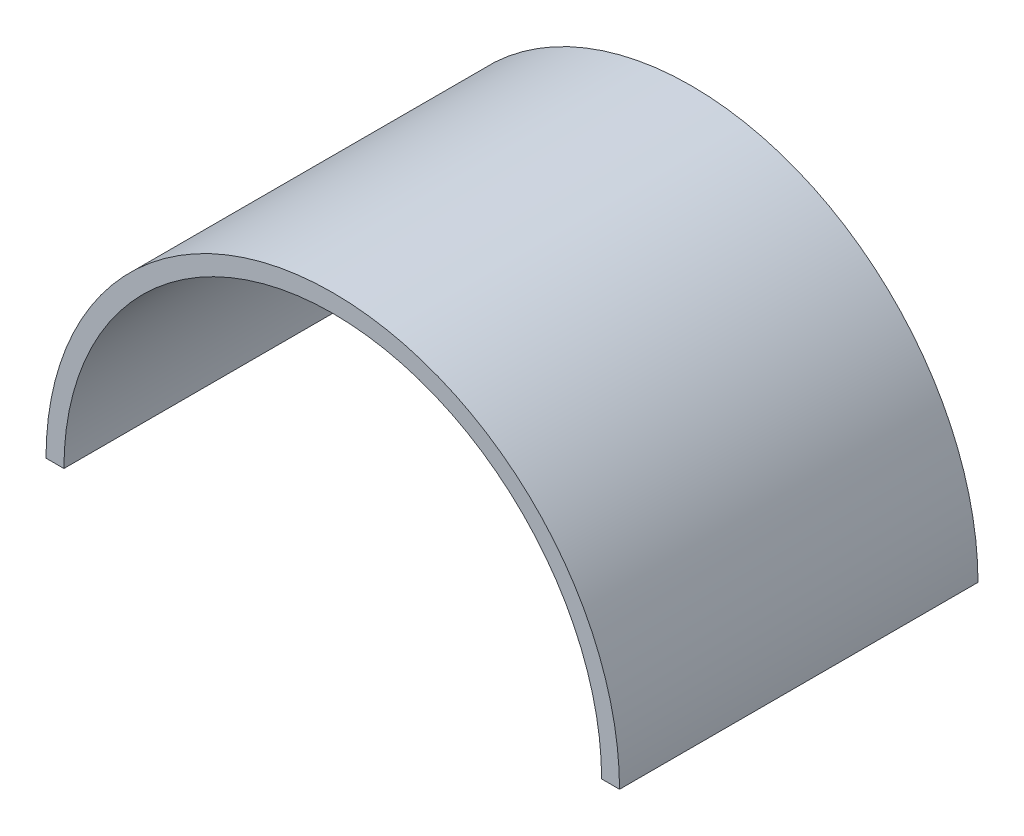
ISO-10303-21;
HEADER;
FILE_DESCRIPTION(('STEP AP214'),'2;1');
FILE_NAME('part.step','',(''),(''),'','','');
FILE_SCHEMA(('AUTOMOTIVE_DESIGN { 1 0 10303 214 1 1 1 1 }'));
ENDSEC;
DATA;
#1=APPLICATION_CONTEXT('core data for automotive mechanical design processes');
#2=APPLICATION_PROTOCOL_DEFINITION('international standard','automotive_design',2000,#1);
#3=PRODUCT_CONTEXT('',#1,'mechanical');
#4=PRODUCT('Part','Part','',(#3));
#5=PRODUCT_RELATED_PRODUCT_CATEGORY('part','',(#4));
#6=PRODUCT_DEFINITION_FORMATION('','',#4);
#7=PRODUCT_DEFINITION_CONTEXT('part definition',#1,'design');
#8=PRODUCT_DEFINITION('design','',#6,#7);
#9=PRODUCT_DEFINITION_SHAPE('','',#8);
#10=(LENGTH_UNIT() NAMED_UNIT(*) SI_UNIT(.MILLI.,.METRE.));
#11=(NAMED_UNIT(*) PLANE_ANGLE_UNIT() SI_UNIT($,.RADIAN.));
#12=(NAMED_UNIT(*) SI_UNIT($,.STERADIAN.) SOLID_ANGLE_UNIT());
#13=UNCERTAINTY_MEASURE_WITH_UNIT(LENGTH_MEASURE(1.E-05),#10,'distance_accuracy_value','');
#14=(GEOMETRIC_REPRESENTATION_CONTEXT(3) GLOBAL_UNCERTAINTY_ASSIGNED_CONTEXT((#13)) GLOBAL_UNIT_ASSIGNED_CONTEXT((#10,
#11,#12)) REPRESENTATION_CONTEXT('',''));
#15=CARTESIAN_POINT('',(0.,0.,0.));
#16=DIRECTION('',(0.,0.,1.));
#17=DIRECTION('',(1.,0.,0.));
#18=AXIS2_PLACEMENT_3D('',#15,#16,#17);
#19=CARTESIAN_POINT('',(0.,0.,63.5));
#20=DIRECTION('',(0.,0.,-1.));
#21=DIRECTION('',(-1.,0.,0.));
#22=AXIS2_PLACEMENT_3D('',#19,#20,#21);
#23=CYLINDRICAL_SURFACE('',#22,47.625);
#24=CARTESIAN_POINT('',(0.,0.,0.));
#25=DIRECTION('',(0.,0.,-1.));
#26=DIRECTION('',(1.,0.,0.));
#27=AXIS2_PLACEMENT_3D('',#24,#25,#26);
#28=CIRCLE('',#27,47.625);
#29=CARTESIAN_POINT('',(-47.625,0.,0.));
#30=VERTEX_POINT('',#29);
#31=CARTESIAN_POINT('',(47.625,0.,0.));
#32=VERTEX_POINT('',#31);
#33=EDGE_CURVE('E98',#30,#32,#28,.T.);
#34=ORIENTED_EDGE('',*,*,#33,.T.);
#35=DIRECTION('',(0.,0.,-1.));
#36=VECTOR('',#35,1.);
#37=CARTESIAN_POINT('',(47.625,0.,63.5));
#38=LINE('',#37,#36);
#39=CARTESIAN_POINT('',(47.625,0.,63.5));
#40=VERTEX_POINT('',#39);
#41=EDGE_CURVE('E11',#40,#32,#38,.T.);
#42=ORIENTED_EDGE('',*,*,#41,.F.);
#43=CARTESIAN_POINT('',(0.,0.,63.5));
#44=DIRECTION('',(0.,0.,-1.));
#45=DIRECTION('',(1.,0.,0.));
#46=AXIS2_PLACEMENT_3D('',#43,#44,#45);
#47=CIRCLE('',#46,47.625);
#48=CARTESIAN_POINT('',(-47.625,0.,63.5));
#49=VERTEX_POINT('',#48);
#50=EDGE_CURVE('E86',#49,#40,#47,.T.);
#51=ORIENTED_EDGE('',*,*,#50,.F.);
#52=DIRECTION('',(0.,0.,-1.));
#53=VECTOR('',#52,1.);
#54=CARTESIAN_POINT('',(-47.625,0.,63.5));
#55=LINE('',#54,#53);
#56=EDGE_CURVE('E94',#49,#30,#55,.T.);
#57=ORIENTED_EDGE('',*,*,#56,.T.);
#58=EDGE_LOOP('',(#34,#42,#51,#57));
#59=FACE_BOUND('',#58,.T.);
#60=ADVANCED_FACE('F35',(#59),#23,.F.);
#61=CARTESIAN_POINT('',(47.625,0.,63.5));
#62=DIRECTION('',(0.,1.,0.));
#63=DIRECTION('',(0.,0.,1.));
#64=AXIS2_PLACEMENT_3D('',#61,#62,#63);
#65=PLANE('',#64);
#66=DIRECTION('',(1.,0.,0.));
#67=VECTOR('',#66,1.);
#68=CARTESIAN_POINT('',(47.625,0.,0.));
#69=LINE('',#68,#67);
#70=CARTESIAN_POINT('',(50.8,0.,0.));
#71=VERTEX_POINT('',#70);
#72=EDGE_CURVE('E90',#32,#71,#69,.T.);
#73=ORIENTED_EDGE('',*,*,#72,.T.);
#74=DIRECTION('',(0.,0.,-1.));
#75=VECTOR('',#74,1.);
#76=CARTESIAN_POINT('',(50.8,0.,63.5));
#77=LINE('',#76,#75);
#78=CARTESIAN_POINT('',(50.8,0.,63.5));
#79=VERTEX_POINT('',#78);
#80=EDGE_CURVE('E43',#79,#71,#77,.T.);
#81=ORIENTED_EDGE('',*,*,#80,.F.);
#82=DIRECTION('',(1.,0.,0.));
#83=VECTOR('',#82,1.);
#84=CARTESIAN_POINT('',(47.625,0.,63.5));
#85=LINE('',#84,#83);
#86=EDGE_CURVE('E81',#40,#79,#85,.T.);
#87=ORIENTED_EDGE('',*,*,#86,.F.);
#88=ORIENTED_EDGE('',*,*,#41,.T.);
#89=EDGE_LOOP('',(#73,#81,#87,#88));
#90=FACE_BOUND('',#89,.T.);
#91=ADVANCED_FACE('F89',(#90),#65,.F.);
#92=CARTESIAN_POINT('',(0.,0.,63.5));
#93=DIRECTION('',(0.,0.,-1.));
#94=DIRECTION('',(-1.,0.,0.));
#95=AXIS2_PLACEMENT_3D('',#92,#93,#94);
#96=CYLINDRICAL_SURFACE('',#95,50.8);
#97=CARTESIAN_POINT('',(0.,0.,0.));
#98=DIRECTION('',(0.,0.,1.));
#99=DIRECTION('',(1.,0.,0.));
#100=AXIS2_PLACEMENT_3D('',#97,#98,#99);
#101=CIRCLE('',#100,50.8);
#102=CARTESIAN_POINT('',(-50.8,0.,0.));
#103=VERTEX_POINT('',#102);
#104=EDGE_CURVE('E68',#71,#103,#101,.T.);
#105=ORIENTED_EDGE('',*,*,#104,.T.);
#106=DIRECTION('',(0.,0.,-1.));
#107=VECTOR('',#106,1.);
#108=CARTESIAN_POINT('',(-50.8,0.,63.5));
#109=LINE('',#108,#107);
#110=CARTESIAN_POINT('',(-50.8,0.,63.5));
#111=VERTEX_POINT('',#110);
#112=EDGE_CURVE('E91',#111,#103,#109,.T.);
#113=ORIENTED_EDGE('',*,*,#112,.F.);
#114=CARTESIAN_POINT('',(0.,0.,63.5));
#115=DIRECTION('',(0.,0.,1.));
#116=DIRECTION('',(1.,0.,0.));
#117=AXIS2_PLACEMENT_3D('',#114,#115,#116);
#118=CIRCLE('',#117,50.8);
#119=EDGE_CURVE('E84',#79,#111,#118,.T.);
#120=ORIENTED_EDGE('',*,*,#119,.F.);
#121=ORIENTED_EDGE('',*,*,#80,.T.);
#122=EDGE_LOOP('',(#105,#113,#120,#121));
#123=FACE_BOUND('',#122,.T.);
#124=ADVANCED_FACE('F92',(#123),#96,.T.);
#125=CARTESIAN_POINT('',(-47.625,0.,63.5));
#126=DIRECTION('',(0.,1.,0.));
#127=DIRECTION('',(0.,0.,1.));
#128=AXIS2_PLACEMENT_3D('',#125,#126,#127);
#129=PLANE('',#128);
#130=DIRECTION('',(1.,0.,0.));
#131=VECTOR('',#130,1.);
#132=CARTESIAN_POINT('',(-47.625,0.,0.));
#133=LINE('',#132,#131);
#134=EDGE_CURVE('E74',#103,#30,#133,.T.);
#135=ORIENTED_EDGE('',*,*,#134,.T.);
#136=ORIENTED_EDGE('',*,*,#56,.F.);
#137=DIRECTION('',(1.,0.,0.));
#138=VECTOR('',#137,1.);
#139=CARTESIAN_POINT('',(-47.625,0.,63.5));
#140=LINE('',#139,#138);
#141=EDGE_CURVE('E51',#111,#49,#140,.T.);
#142=ORIENTED_EDGE('',*,*,#141,.F.);
#143=ORIENTED_EDGE('',*,*,#112,.T.);
#144=EDGE_LOOP('',(#135,#136,#142,#143));
#145=FACE_BOUND('',#144,.T.);
#146=ADVANCED_FACE('F105',(#145),#129,.F.);
#147=CARTESIAN_POINT('',(0.,0.,63.5));
#148=DIRECTION('',(0.,0.,1.));
#149=DIRECTION('',(1.,0.,0.));
#150=AXIS2_PLACEMENT_3D('',#147,#148,#149);
#151=PLANE('',#150);
#152=ORIENTED_EDGE('',*,*,#50,.T.);
#153=ORIENTED_EDGE('',*,*,#86,.T.);
#154=ORIENTED_EDGE('',*,*,#119,.T.);
#155=ORIENTED_EDGE('',*,*,#141,.T.);
#156=EDGE_LOOP('',(#152,#153,#154,#155));
#157=FACE_BOUND('',#156,.T.);
#158=ADVANCED_FACE('F82',(#157),#151,.T.);
#159=CARTESIAN_POINT('',(0.,0.,0.));
#160=DIRECTION('',(0.,0.,1.));
#161=DIRECTION('',(1.,0.,0.));
#162=AXIS2_PLACEMENT_3D('',#159,#160,#161);
#163=PLANE('',#162);
#164=ORIENTED_EDGE('',*,*,#33,.F.);
#165=ORIENTED_EDGE('',*,*,#134,.F.);
#166=ORIENTED_EDGE('',*,*,#104,.F.);
#167=ORIENTED_EDGE('',*,*,#72,.F.);
#168=EDGE_LOOP('',(#164,#165,#166,#167));
#169=FACE_BOUND('',#168,.T.);
#170=ADVANCED_FACE('F108',(#169),#163,.F.);
#171=CLOSED_SHELL('',(#60,#91,#124,#146,#158,#170));
#172=MANIFOLD_SOLID_BREP('B2',#171);
#173=ADVANCED_BREP_SHAPE_REPRESENTATION('',(#18,#172),#14);
#174=SHAPE_DEFINITION_REPRESENTATION(#9,#173);
ENDSEC;
END-ISO-10303-21;
